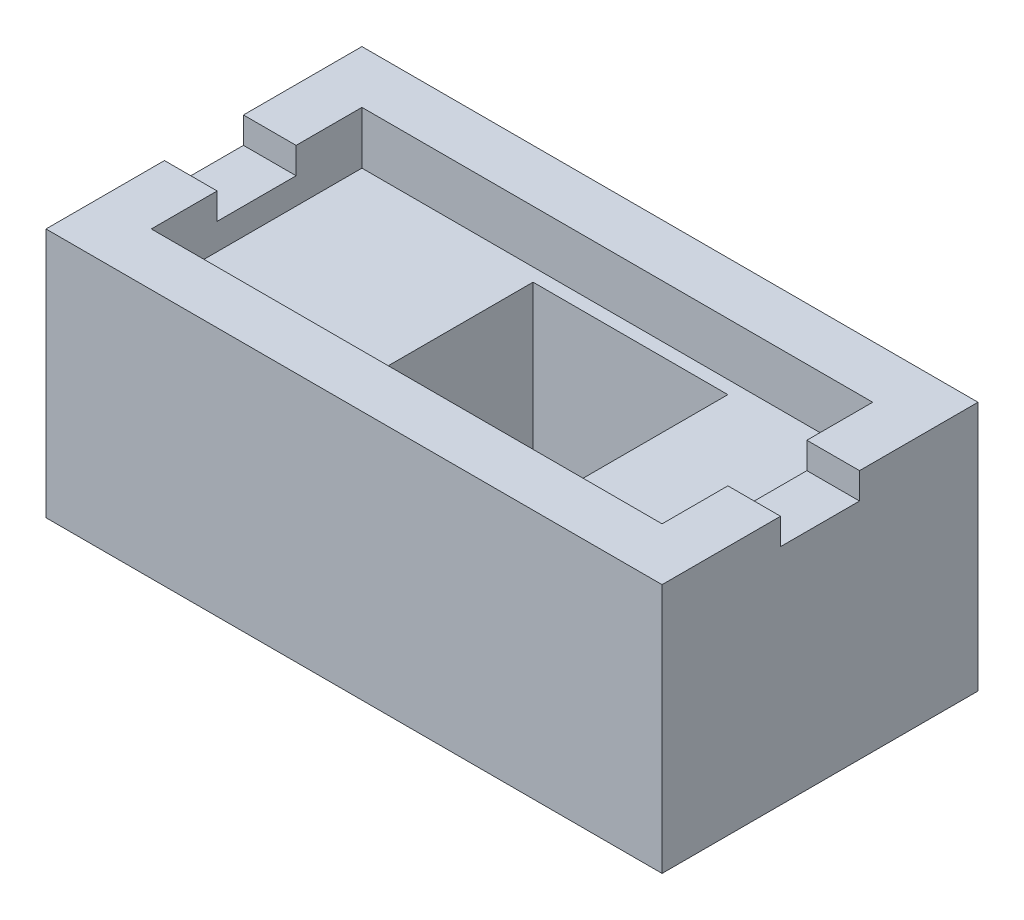
ISO-10303-21;
HEADER;
FILE_DESCRIPTION(('STEP AP214'),'2;1');
FILE_NAME('part.step','',(''),(''),'','','');
FILE_SCHEMA(('AUTOMOTIVE_DESIGN { 1 0 10303 214 1 1 1 1 }'));
ENDSEC;
DATA;
#1=APPLICATION_CONTEXT('core data for automotive mechanical design processes');
#2=APPLICATION_PROTOCOL_DEFINITION('international standard','automotive_design',2000,#1);
#3=PRODUCT_CONTEXT('',#1,'mechanical');
#4=PRODUCT('Part','Part','',(#3));
#5=PRODUCT_RELATED_PRODUCT_CATEGORY('part','',(#4));
#6=PRODUCT_DEFINITION_FORMATION('','',#4);
#7=PRODUCT_DEFINITION_CONTEXT('part definition',#1,'design');
#8=PRODUCT_DEFINITION('design','',#6,#7);
#9=PRODUCT_DEFINITION_SHAPE('','',#8);
#10=(LENGTH_UNIT() NAMED_UNIT(*) SI_UNIT(.MILLI.,.METRE.));
#11=(NAMED_UNIT(*) PLANE_ANGLE_UNIT() SI_UNIT($,.RADIAN.));
#12=(NAMED_UNIT(*) SI_UNIT($,.STERADIAN.) SOLID_ANGLE_UNIT());
#13=UNCERTAINTY_MEASURE_WITH_UNIT(LENGTH_MEASURE(1.E-05),#10,'distance_accuracy_value','');
#14=(GEOMETRIC_REPRESENTATION_CONTEXT(3) GLOBAL_UNCERTAINTY_ASSIGNED_CONTEXT((#13)) GLOBAL_UNIT_ASSIGNED_CONTEXT((#10,
#11,#12)) REPRESENTATION_CONTEXT('',''));
#15=CARTESIAN_POINT('',(0.,0.,0.));
#16=DIRECTION('',(0.,0.,1.));
#17=DIRECTION('',(1.,0.,0.));
#18=AXIS2_PLACEMENT_3D('',#15,#16,#17);
#19=CARTESIAN_POINT('',(9.,9.5,2.5));
#20=DIRECTION('',(0.,0.,-1.));
#21=DIRECTION('',(-1.,0.,0.));
#22=AXIS2_PLACEMENT_3D('',#19,#20,#21);
#23=PLANE('',#22);
#24=DIRECTION('',(1.,0.,0.));
#25=VECTOR('',#24,1.);
#26=CARTESIAN_POINT('',(9.,7.5,2.5));
#27=LINE('',#26,#25);
#28=CARTESIAN_POINT('',(9.,7.5,2.5));
#29=VERTEX_POINT('',#28);
#30=CARTESIAN_POINT('',(16.4,7.5,2.5));
#31=VERTEX_POINT('',#30);
#32=EDGE_CURVE('E73',#29,#31,#27,.T.);
#33=ORIENTED_EDGE('',*,*,#32,.F.);
#34=DIRECTION('',(0.,-1.,0.));
#35=VECTOR('',#34,1.);
#36=CARTESIAN_POINT('',(9.,9.5,2.5));
#37=LINE('',#36,#35);
#38=CARTESIAN_POINT('',(9.,0.,2.5));
#39=VERTEX_POINT('',#38);
#40=EDGE_CURVE('E299',#29,#39,#37,.T.);
#41=ORIENTED_EDGE('',*,*,#40,.T.);
#42=DIRECTION('',(1.,0.,0.));
#43=VECTOR('',#42,1.);
#44=CARTESIAN_POINT('',(9.,0.,2.5));
#45=LINE('',#44,#43);
#46=CARTESIAN_POINT('',(16.4,0.,2.5));
#47=VERTEX_POINT('',#46);
#48=EDGE_CURVE('E286',#39,#47,#45,.T.);
#49=ORIENTED_EDGE('',*,*,#48,.T.);
#50=DIRECTION('',(0.,-1.,0.));
#51=VECTOR('',#50,1.);
#52=CARTESIAN_POINT('',(16.4,9.5,2.5));
#53=LINE('',#52,#51);
#54=EDGE_CURVE('E298',#31,#47,#53,.T.);
#55=ORIENTED_EDGE('',*,*,#54,.F.);
#56=EDGE_LOOP('',(#33,#41,#49,#55));
#57=FACE_BOUND('',#56,.T.);
#58=ADVANCED_FACE('F59',(#57),#23,.F.);
#59=CARTESIAN_POINT('',(9.,9.5,2.5));
#60=DIRECTION('',(1.,0.,0.));
#61=DIRECTION('',(0.,0.,-1.));
#62=AXIS2_PLACEMENT_3D('',#59,#60,#61);
#63=PLANE('',#62);
#64=ORIENTED_EDGE('',*,*,#40,.F.);
#65=DIRECTION('',(0.,0.,1.));
#66=VECTOR('',#65,1.);
#67=CARTESIAN_POINT('',(9.,7.5,2.5));
#68=LINE('',#67,#66);
#69=CARTESIAN_POINT('',(9.,7.5,9.5));
#70=VERTEX_POINT('',#69);
#71=EDGE_CURVE('E249',#29,#70,#68,.T.);
#72=ORIENTED_EDGE('',*,*,#71,.T.);
#73=DIRECTION('',(0.,-1.,0.));
#74=VECTOR('',#73,1.);
#75=CARTESIAN_POINT('',(9.,9.5,9.5));
#76=LINE('',#75,#74);
#77=CARTESIAN_POINT('',(9.,0.,9.5));
#78=VERTEX_POINT('',#77);
#79=EDGE_CURVE('E302',#70,#78,#76,.T.);
#80=ORIENTED_EDGE('',*,*,#79,.T.);
#81=DIRECTION('',(0.,0.,1.));
#82=VECTOR('',#81,1.);
#83=CARTESIAN_POINT('',(9.,0.,2.5));
#84=LINE('',#83,#82);
#85=EDGE_CURVE('E295',#39,#78,#84,.T.);
#86=ORIENTED_EDGE('',*,*,#85,.F.);
#87=EDGE_LOOP('',(#64,#72,#80,#86));
#88=FACE_BOUND('',#87,.T.);
#89=ADVANCED_FACE('F409',(#88),#63,.T.);
#90=CARTESIAN_POINT('',(9.,9.5,9.5));
#91=DIRECTION('',(0.,0.,-1.));
#92=DIRECTION('',(-1.,0.,0.));
#93=AXIS2_PLACEMENT_3D('',#90,#91,#92);
#94=PLANE('',#93);
#95=ORIENTED_EDGE('',*,*,#79,.F.);
#96=DIRECTION('',(1.,0.,0.));
#97=VECTOR('',#96,1.);
#98=CARTESIAN_POINT('',(9.,7.5,9.5));
#99=LINE('',#98,#97);
#100=CARTESIAN_POINT('',(16.4,7.5,9.5));
#101=VERTEX_POINT('',#100);
#102=EDGE_CURVE('E246',#70,#101,#99,.T.);
#103=ORIENTED_EDGE('',*,*,#102,.T.);
#104=DIRECTION('',(0.,-1.,0.));
#105=VECTOR('',#104,1.);
#106=CARTESIAN_POINT('',(16.4,9.5,9.5));
#107=LINE('',#106,#105);
#108=CARTESIAN_POINT('',(16.4,0.,9.5));
#109=VERTEX_POINT('',#108);
#110=EDGE_CURVE('E304',#101,#109,#107,.T.);
#111=ORIENTED_EDGE('',*,*,#110,.T.);
#112=DIRECTION('',(1.,0.,0.));
#113=VECTOR('',#112,1.);
#114=CARTESIAN_POINT('',(9.,0.,9.5));
#115=LINE('',#114,#113);
#116=EDGE_CURVE('E292',#78,#109,#115,.T.);
#117=ORIENTED_EDGE('',*,*,#116,.F.);
#118=EDGE_LOOP('',(#95,#103,#111,#117));
#119=FACE_BOUND('',#118,.T.);
#120=ADVANCED_FACE('F415',(#119),#94,.T.);
#121=CARTESIAN_POINT('',(16.4,9.5,2.5));
#122=DIRECTION('',(1.,0.,0.));
#123=DIRECTION('',(0.,0.,-1.));
#124=AXIS2_PLACEMENT_3D('',#121,#122,#123);
#125=PLANE('',#124);
#126=DIRECTION('',(0.,0.,1.));
#127=VECTOR('',#126,1.);
#128=CARTESIAN_POINT('',(16.4,7.5,2.5));
#129=LINE('',#128,#127);
#130=EDGE_CURVE('E12',#31,#101,#129,.T.);
#131=ORIENTED_EDGE('',*,*,#130,.F.);
#132=ORIENTED_EDGE('',*,*,#54,.T.);
#133=DIRECTION('',(0.,0.,1.));
#134=VECTOR('',#133,1.);
#135=CARTESIAN_POINT('',(16.4,0.,2.5));
#136=LINE('',#135,#134);
#137=EDGE_CURVE('E289',#47,#109,#136,.T.);
#138=ORIENTED_EDGE('',*,*,#137,.T.);
#139=ORIENTED_EDGE('',*,*,#110,.F.);
#140=EDGE_LOOP('',(#131,#132,#138,#139));
#141=FACE_BOUND('',#140,.T.);
#142=ADVANCED_FACE('F406',(#141),#125,.F.);
#143=CARTESIAN_POINT('',(0.,9.5,0.));
#144=DIRECTION('',(0.,-1.,0.));
#145=DIRECTION('',(0.,0.,-1.));
#146=AXIS2_PLACEMENT_3D('',#143,#144,#145);
#147=PLANE('',#146);
#148=DIRECTION('',(1.,0.,0.));
#149=VECTOR('',#148,1.);
#150=CARTESIAN_POINT('',(0.,9.5,4.5));
#151=LINE('',#150,#149);
#152=CARTESIAN_POINT('',(0.,9.5,4.5));
#153=VERTEX_POINT('',#152);
#154=CARTESIAN_POINT('',(2.,9.5,4.5));
#155=VERTEX_POINT('',#154);
#156=EDGE_CURVE('E258',#153,#155,#151,.T.);
#157=ORIENTED_EDGE('',*,*,#156,.T.);
#158=DIRECTION('',(0.,0.,1.));
#159=VECTOR('',#158,1.);
#160=CARTESIAN_POINT('',(2.,9.5,2.));
#161=LINE('',#160,#159);
#162=CARTESIAN_POINT('',(2.,9.5,2.));
#163=VERTEX_POINT('',#162);
#164=EDGE_CURVE('E226',#163,#155,#161,.T.);
#165=ORIENTED_EDGE('',*,*,#164,.F.);
#166=DIRECTION('',(-1.,0.,0.));
#167=VECTOR('',#166,1.);
#168=CARTESIAN_POINT('',(2.,9.5,2.));
#169=LINE('',#168,#167);
#170=CARTESIAN_POINT('',(21.4,9.5,2.));
#171=VERTEX_POINT('',#170);
#172=EDGE_CURVE('E218',#171,#163,#169,.T.);
#173=ORIENTED_EDGE('',*,*,#172,.F.);
#174=DIRECTION('',(0.,0.,-1.));
#175=VECTOR('',#174,1.);
#176=CARTESIAN_POINT('',(21.4,9.5,2.));
#177=LINE('',#176,#175);
#178=CARTESIAN_POINT('',(21.4,9.5,4.5));
#179=VERTEX_POINT('',#178);
#180=EDGE_CURVE('E230',#179,#171,#177,.T.);
#181=ORIENTED_EDGE('',*,*,#180,.F.);
#182=CARTESIAN_POINT('',(23.4,9.5,4.5));
#183=VERTEX_POINT('',#182);
#184=EDGE_CURVE('E273',#179,#183,#151,.T.);
#185=ORIENTED_EDGE('',*,*,#184,.T.);
#186=DIRECTION('',(0.,0.,1.));
#187=VECTOR('',#186,1.);
#188=CARTESIAN_POINT('',(23.4,9.5,0.));
#189=LINE('',#188,#187);
#190=CARTESIAN_POINT('',(23.4,9.5,0.));
#191=VERTEX_POINT('',#190);
#192=EDGE_CURVE('E312',#191,#183,#189,.T.);
#193=ORIENTED_EDGE('',*,*,#192,.F.);
#194=DIRECTION('',(1.,0.,0.));
#195=VECTOR('',#194,1.);
#196=CARTESIAN_POINT('',(0.,9.5,0.));
#197=LINE('',#196,#195);
#198=CARTESIAN_POINT('',(0.,9.5,0.));
#199=VERTEX_POINT('',#198);
#200=EDGE_CURVE('E307',#199,#191,#197,.T.);
#201=ORIENTED_EDGE('',*,*,#200,.F.);
#202=DIRECTION('',(0.,0.,1.));
#203=VECTOR('',#202,1.);
#204=CARTESIAN_POINT('',(0.,9.5,0.));
#205=LINE('',#204,#203);
#206=EDGE_CURVE('E319',#199,#153,#205,.T.);
#207=ORIENTED_EDGE('',*,*,#206,.T.);
#208=EDGE_LOOP('',(#157,#165,#173,#181,#185,#193,#201,#207));
#209=FACE_BOUND('',#208,.T.);
#210=ADVANCED_FACE('F371',(#209),#147,.F.);
#211=CARTESIAN_POINT('',(0.,9.5,0.));
#212=DIRECTION('',(0.,0.,-1.));
#213=DIRECTION('',(-1.,0.,0.));
#214=AXIS2_PLACEMENT_3D('',#211,#212,#213);
#215=PLANE('',#214);
#216=DIRECTION('',(1.,0.,0.));
#217=VECTOR('',#216,1.);
#218=CARTESIAN_POINT('',(0.,0.,0.));
#219=LINE('',#218,#217);
#220=CARTESIAN_POINT('',(0.,0.,0.));
#221=VERTEX_POINT('',#220);
#222=CARTESIAN_POINT('',(23.4,0.,0.));
#223=VERTEX_POINT('',#222);
#224=EDGE_CURVE('E301',#221,#223,#219,.T.);
#225=ORIENTED_EDGE('',*,*,#224,.F.);
#226=DIRECTION('',(0.,-1.,0.));
#227=VECTOR('',#226,1.);
#228=CARTESIAN_POINT('',(0.,9.5,0.));
#229=LINE('',#228,#227);
#230=EDGE_CURVE('E332',#199,#221,#229,.T.);
#231=ORIENTED_EDGE('',*,*,#230,.F.);
#232=ORIENTED_EDGE('',*,*,#200,.T.);
#233=DIRECTION('',(0.,-1.,0.));
#234=VECTOR('',#233,1.);
#235=CARTESIAN_POINT('',(23.4,9.5,0.));
#236=LINE('',#235,#234);
#237=EDGE_CURVE('E322',#191,#223,#236,.T.);
#238=ORIENTED_EDGE('',*,*,#237,.T.);
#239=EDGE_LOOP('',(#225,#231,#232,#238));
#240=FACE_BOUND('',#239,.T.);
#241=ADVANCED_FACE('F61',(#240),#215,.T.);
#242=CARTESIAN_POINT('',(0.,9.5,0.));
#243=DIRECTION('',(1.,0.,0.));
#244=DIRECTION('',(0.,0.,-1.));
#245=AXIS2_PLACEMENT_3D('',#242,#243,#244);
#246=PLANE('',#245);
#247=CARTESIAN_POINT('',(0.,9.5,7.5));
#248=VERTEX_POINT('',#247);
#249=CARTESIAN_POINT('',(0.,9.5,12.));
#250=VERTEX_POINT('',#249);
#251=EDGE_CURVE('E318',#248,#250,#205,.T.);
#252=ORIENTED_EDGE('',*,*,#251,.F.);
#253=DIRECTION('',(0.,1.,0.));
#254=VECTOR('',#253,1.);
#255=CARTESIAN_POINT('',(0.,8.5,7.5));
#256=LINE('',#255,#254);
#257=CARTESIAN_POINT('',(0.,8.5,7.5));
#258=VERTEX_POINT('',#257);
#259=EDGE_CURVE('E281',#258,#248,#256,.T.);
#260=ORIENTED_EDGE('',*,*,#259,.F.);
#261=DIRECTION('',(0.,0.,1.));
#262=VECTOR('',#261,1.);
#263=CARTESIAN_POINT('',(0.,8.5,0.));
#264=LINE('',#263,#262);
#265=CARTESIAN_POINT('',(0.,8.5,4.5));
#266=VERTEX_POINT('',#265);
#267=EDGE_CURVE('E262',#266,#258,#264,.T.);
#268=ORIENTED_EDGE('',*,*,#267,.F.);
#269=DIRECTION('',(0.,1.,0.));
#270=VECTOR('',#269,1.);
#271=CARTESIAN_POINT('',(0.,8.5,4.5));
#272=LINE('',#271,#270);
#273=EDGE_CURVE('E278',#266,#153,#272,.T.);
#274=ORIENTED_EDGE('',*,*,#273,.T.);
#275=ORIENTED_EDGE('',*,*,#206,.F.);
#276=ORIENTED_EDGE('',*,*,#230,.T.);
#277=DIRECTION('',(0.,0.,1.));
#278=VECTOR('',#277,1.);
#279=CARTESIAN_POINT('',(0.,0.,0.));
#280=LINE('',#279,#278);
#281=CARTESIAN_POINT('',(0.,0.,12.));
#282=VERTEX_POINT('',#281);
#283=EDGE_CURVE('E311',#221,#282,#280,.T.);
#284=ORIENTED_EDGE('',*,*,#283,.T.);
#285=DIRECTION('',(0.,-1.,0.));
#286=VECTOR('',#285,1.);
#287=CARTESIAN_POINT('',(0.,9.5,12.));
#288=LINE('',#287,#286);
#289=EDGE_CURVE('E335',#250,#282,#288,.T.);
#290=ORIENTED_EDGE('',*,*,#289,.F.);
#291=EDGE_LOOP('',(#252,#260,#268,#274,#275,#276,#284,#290));
#292=FACE_BOUND('',#291,.T.);
#293=ADVANCED_FACE('F383',(#292),#246,.F.);
#294=CARTESIAN_POINT('',(0.,9.5,12.));
#295=DIRECTION('',(0.,0.,-1.));
#296=DIRECTION('',(-1.,0.,0.));
#297=AXIS2_PLACEMENT_3D('',#294,#295,#296);
#298=PLANE('',#297);
#299=DIRECTION('',(1.,0.,0.));
#300=VECTOR('',#299,1.);
#301=CARTESIAN_POINT('',(0.,0.,12.));
#302=LINE('',#301,#300);
#303=CARTESIAN_POINT('',(23.4,0.,12.));
#304=VERTEX_POINT('',#303);
#305=EDGE_CURVE('E328',#282,#304,#302,.T.);
#306=ORIENTED_EDGE('',*,*,#305,.T.);
#307=DIRECTION('',(0.,-1.,0.));
#308=VECTOR('',#307,1.);
#309=CARTESIAN_POINT('',(23.4,9.5,12.));
#310=LINE('',#309,#308);
#311=CARTESIAN_POINT('',(23.4,9.5,12.));
#312=VERTEX_POINT('',#311);
#313=EDGE_CURVE('E338',#312,#304,#310,.T.);
#314=ORIENTED_EDGE('',*,*,#313,.F.);
#315=DIRECTION('',(1.,0.,0.));
#316=VECTOR('',#315,1.);
#317=CARTESIAN_POINT('',(0.,9.5,12.));
#318=LINE('',#317,#316);
#319=EDGE_CURVE('E315',#250,#312,#318,.T.);
#320=ORIENTED_EDGE('',*,*,#319,.F.);
#321=ORIENTED_EDGE('',*,*,#289,.T.);
#322=EDGE_LOOP('',(#306,#314,#320,#321));
#323=FACE_BOUND('',#322,.T.);
#324=ADVANCED_FACE('F395',(#323),#298,.F.);
#325=CARTESIAN_POINT('',(23.4,9.5,0.));
#326=DIRECTION('',(1.,0.,0.));
#327=DIRECTION('',(0.,0.,-1.));
#328=AXIS2_PLACEMENT_3D('',#325,#326,#327);
#329=PLANE('',#328);
#330=DIRECTION('',(0.,1.,0.));
#331=VECTOR('',#330,1.);
#332=CARTESIAN_POINT('',(23.4,8.5,7.5));
#333=LINE('',#332,#331);
#334=CARTESIAN_POINT('',(23.4,8.5,7.5));
#335=VERTEX_POINT('',#334);
#336=CARTESIAN_POINT('',(23.4,9.5,7.5));
#337=VERTEX_POINT('',#336);
#338=EDGE_CURVE('E283',#335,#337,#333,.T.);
#339=ORIENTED_EDGE('',*,*,#338,.T.);
#340=EDGE_CURVE('E310',#337,#312,#189,.T.);
#341=ORIENTED_EDGE('',*,*,#340,.T.);
#342=ORIENTED_EDGE('',*,*,#313,.T.);
#343=DIRECTION('',(0.,0.,1.));
#344=VECTOR('',#343,1.);
#345=CARTESIAN_POINT('',(23.4,0.,0.));
#346=LINE('',#345,#344);
#347=EDGE_CURVE('E325',#223,#304,#346,.T.);
#348=ORIENTED_EDGE('',*,*,#347,.F.);
#349=ORIENTED_EDGE('',*,*,#237,.F.);
#350=ORIENTED_EDGE('',*,*,#192,.T.);
#351=DIRECTION('',(0.,1.,0.));
#352=VECTOR('',#351,1.);
#353=CARTESIAN_POINT('',(23.4,8.5,4.5));
#354=LINE('',#353,#352);
#355=CARTESIAN_POINT('',(23.4,8.5,4.5));
#356=VERTEX_POINT('',#355);
#357=EDGE_CURVE('E269',#356,#183,#354,.T.);
#358=ORIENTED_EDGE('',*,*,#357,.F.);
#359=DIRECTION('',(0.,0.,1.));
#360=VECTOR('',#359,1.);
#361=CARTESIAN_POINT('',(23.4,8.5,0.));
#362=LINE('',#361,#360);
#363=EDGE_CURVE('E254',#356,#335,#362,.T.);
#364=ORIENTED_EDGE('',*,*,#363,.T.);
#365=EDGE_LOOP('',(#339,#341,#342,#348,#349,#350,#358,#364));
#366=FACE_BOUND('',#365,.T.);
#367=ADVANCED_FACE('F356',(#366),#329,.T.);
#368=DIRECTION('',(1.,0.,0.));
#369=VECTOR('',#368,1.);
#370=CARTESIAN_POINT('',(2.,9.5,10.));
#371=LINE('',#370,#369);
#372=CARTESIAN_POINT('',(2.,9.5,10.));
#373=VERTEX_POINT('',#372);
#374=CARTESIAN_POINT('',(21.4,9.5,10.));
#375=VERTEX_POINT('',#374);
#376=EDGE_CURVE('E228',#373,#375,#371,.T.);
#377=ORIENTED_EDGE('',*,*,#376,.F.);
#378=CARTESIAN_POINT('',(2.,9.5,7.5));
#379=VERTEX_POINT('',#378);
#380=EDGE_CURVE('E201',#379,#373,#161,.T.);
#381=ORIENTED_EDGE('',*,*,#380,.F.);
#382=DIRECTION('',(1.,0.,0.));
#383=VECTOR('',#382,1.);
#384=CARTESIAN_POINT('',(0.,9.5,7.5));
#385=LINE('',#384,#383);
#386=EDGE_CURVE('E270',#248,#379,#385,.T.);
#387=ORIENTED_EDGE('',*,*,#386,.F.);
#388=ORIENTED_EDGE('',*,*,#251,.T.);
#389=ORIENTED_EDGE('',*,*,#319,.T.);
#390=ORIENTED_EDGE('',*,*,#340,.F.);
#391=CARTESIAN_POINT('',(21.4,9.5,7.5));
#392=VERTEX_POINT('',#391);
#393=EDGE_CURVE('E253',#392,#337,#385,.T.);
#394=ORIENTED_EDGE('',*,*,#393,.F.);
#395=EDGE_CURVE('E221',#375,#392,#177,.T.);
#396=ORIENTED_EDGE('',*,*,#395,.F.);
#397=EDGE_LOOP('',(#377,#381,#387,#388,#389,#390,#394,#396));
#398=FACE_BOUND('',#397,.T.);
#399=ADVANCED_FACE('F352',(#398),#147,.F.);
#400=CARTESIAN_POINT('',(0.,0.,0.));
#401=DIRECTION('',(0.,-1.,0.));
#402=DIRECTION('',(0.,0.,-1.));
#403=AXIS2_PLACEMENT_3D('',#400,#401,#402);
#404=PLANE('',#403);
#405=ORIENTED_EDGE('',*,*,#48,.F.);
#406=ORIENTED_EDGE('',*,*,#85,.T.);
#407=ORIENTED_EDGE('',*,*,#116,.T.);
#408=ORIENTED_EDGE('',*,*,#137,.F.);
#409=EDGE_LOOP('',(#405,#406,#407,#408));
#410=FACE_BOUND('',#409,.T.);
#411=ORIENTED_EDGE('',*,*,#224,.T.);
#412=ORIENTED_EDGE('',*,*,#347,.T.);
#413=ORIENTED_EDGE('',*,*,#305,.F.);
#414=ORIENTED_EDGE('',*,*,#283,.F.);
#415=EDGE_LOOP('',(#411,#412,#413,#414));
#416=FACE_BOUND('',#415,.T.);
#417=ADVANCED_FACE('F397',(#410,#416),#404,.T.);
#418=CARTESIAN_POINT('',(0.,8.5,0.));
#419=DIRECTION('',(0.,1.,0.));
#420=DIRECTION('',(0.,0.,1.));
#421=AXIS2_PLACEMENT_3D('',#418,#419,#420);
#422=PLANE('',#421);
#423=DIRECTION('',(0.,0.,-1.));
#424=VECTOR('',#423,1.);
#425=CARTESIAN_POINT('',(21.4,8.5,0.));
#426=LINE('',#425,#424);
#427=CARTESIAN_POINT('',(21.4,8.5,7.5));
#428=VERTEX_POINT('',#427);
#429=CARTESIAN_POINT('',(21.4,8.5,4.5));
#430=VERTEX_POINT('',#429);
#431=EDGE_CURVE('E242',#428,#430,#426,.T.);
#432=ORIENTED_EDGE('',*,*,#431,.F.);
#433=DIRECTION('',(1.,0.,0.));
#434=VECTOR('',#433,1.);
#435=CARTESIAN_POINT('',(0.,8.5,7.5));
#436=LINE('',#435,#434);
#437=EDGE_CURVE('E257',#428,#335,#436,.T.);
#438=ORIENTED_EDGE('',*,*,#437,.T.);
#439=ORIENTED_EDGE('',*,*,#363,.F.);
#440=DIRECTION('',(1.,0.,0.));
#441=VECTOR('',#440,1.);
#442=CARTESIAN_POINT('',(0.,8.5,4.5));
#443=LINE('',#442,#441);
#444=EDGE_CURVE('E265',#430,#356,#443,.T.);
#445=ORIENTED_EDGE('',*,*,#444,.F.);
#446=EDGE_LOOP('',(#432,#438,#439,#445));
#447=FACE_BOUND('',#446,.T.);
#448=ADVANCED_FACE('F362',(#447),#422,.T.);
#449=CARTESIAN_POINT('',(0.,8.5,4.5));
#450=DIRECTION('',(0.,0.,1.));
#451=DIRECTION('',(1.,0.,0.));
#452=AXIS2_PLACEMENT_3D('',#449,#450,#451);
#453=PLANE('',#452);
#454=DIRECTION('',(0.,1.,0.));
#455=VECTOR('',#454,1.);
#456=CARTESIAN_POINT('',(21.4,8.5,4.5));
#457=LINE('',#456,#455);
#458=EDGE_CURVE('E244',#430,#179,#457,.T.);
#459=ORIENTED_EDGE('',*,*,#458,.F.);
#460=ORIENTED_EDGE('',*,*,#444,.T.);
#461=ORIENTED_EDGE('',*,*,#357,.T.);
#462=ORIENTED_EDGE('',*,*,#184,.F.);
#463=EDGE_LOOP('',(#459,#460,#461,#462));
#464=FACE_BOUND('',#463,.T.);
#465=ADVANCED_FACE('F368',(#464),#453,.T.);
#466=CARTESIAN_POINT('',(0.,8.5,7.5));
#467=DIRECTION('',(0.,0.,1.));
#468=DIRECTION('',(1.,0.,0.));
#469=AXIS2_PLACEMENT_3D('',#466,#467,#468);
#470=PLANE('',#469);
#471=ORIENTED_EDGE('',*,*,#437,.F.);
#472=DIRECTION('',(0.,1.,0.));
#473=VECTOR('',#472,1.);
#474=CARTESIAN_POINT('',(21.4,8.5,7.5));
#475=LINE('',#474,#473);
#476=EDGE_CURVE('E67',#428,#392,#475,.T.);
#477=ORIENTED_EDGE('',*,*,#476,.T.);
#478=ORIENTED_EDGE('',*,*,#393,.T.);
#479=ORIENTED_EDGE('',*,*,#338,.F.);
#480=EDGE_LOOP('',(#471,#477,#478,#479));
#481=FACE_BOUND('',#480,.T.);
#482=ADVANCED_FACE('F345',(#481),#470,.F.);
#483=ORIENTED_EDGE('',*,*,#386,.T.);
#484=DIRECTION('',(0.,-1.,0.));
#485=VECTOR('',#484,1.);
#486=CARTESIAN_POINT('',(2.,8.5,7.5));
#487=LINE('',#486,#485);
#488=CARTESIAN_POINT('',(2.,8.5,7.5));
#489=VERTEX_POINT('',#488);
#490=EDGE_CURVE('E239',#379,#489,#487,.T.);
#491=ORIENTED_EDGE('',*,*,#490,.T.);
#492=EDGE_CURVE('E259',#258,#489,#436,.T.);
#493=ORIENTED_EDGE('',*,*,#492,.F.);
#494=ORIENTED_EDGE('',*,*,#259,.T.);
#495=EDGE_LOOP('',(#483,#491,#493,#494));
#496=FACE_BOUND('',#495,.T.);
#497=ADVANCED_FACE('F390',(#496),#470,.F.);
#498=DIRECTION('',(0.,-1.,0.));
#499=VECTOR('',#498,1.);
#500=CARTESIAN_POINT('',(2.,8.5,4.5));
#501=LINE('',#500,#499);
#502=CARTESIAN_POINT('',(2.,8.5,4.5));
#503=VERTEX_POINT('',#502);
#504=EDGE_CURVE('E81',#155,#503,#501,.T.);
#505=ORIENTED_EDGE('',*,*,#504,.F.);
#506=ORIENTED_EDGE('',*,*,#156,.F.);
#507=ORIENTED_EDGE('',*,*,#273,.F.);
#508=EDGE_CURVE('E266',#266,#503,#443,.T.);
#509=ORIENTED_EDGE('',*,*,#508,.T.);
#510=EDGE_LOOP('',(#505,#506,#507,#509));
#511=FACE_BOUND('',#510,.T.);
#512=ADVANCED_FACE('F378',(#511),#453,.T.);
#513=DIRECTION('',(0.,0.,1.));
#514=VECTOR('',#513,1.);
#515=CARTESIAN_POINT('',(2.,8.5,0.));
#516=LINE('',#515,#514);
#517=EDGE_CURVE('E334',#503,#489,#516,.T.);
#518=ORIENTED_EDGE('',*,*,#517,.F.);
#519=ORIENTED_EDGE('',*,*,#508,.F.);
#520=ORIENTED_EDGE('',*,*,#267,.T.);
#521=ORIENTED_EDGE('',*,*,#492,.T.);
#522=EDGE_LOOP('',(#518,#519,#520,#521));
#523=FACE_BOUND('',#522,.T.);
#524=ADVANCED_FACE('F388',(#523),#422,.T.);
#525=CARTESIAN_POINT('',(0.,7.5,0.));
#526=DIRECTION('',(0.,1.,0.));
#527=DIRECTION('',(0.,0.,1.));
#528=AXIS2_PLACEMENT_3D('',#525,#526,#527);
#529=PLANE('',#528);
#530=DIRECTION('',(0.,0.,1.));
#531=VECTOR('',#530,1.);
#532=CARTESIAN_POINT('',(2.,7.5,2.));
#533=LINE('',#532,#531);
#534=CARTESIAN_POINT('',(2.,7.5,2.));
#535=VERTEX_POINT('',#534);
#536=CARTESIAN_POINT('',(2.,7.5,10.));
#537=VERTEX_POINT('',#536);
#538=EDGE_CURVE('E198',#535,#537,#533,.T.);
#539=ORIENTED_EDGE('',*,*,#538,.T.);
#540=DIRECTION('',(1.,0.,0.));
#541=VECTOR('',#540,1.);
#542=CARTESIAN_POINT('',(2.,7.5,10.));
#543=LINE('',#542,#541);
#544=CARTESIAN_POINT('',(21.4,7.5,10.));
#545=VERTEX_POINT('',#544);
#546=EDGE_CURVE('E209',#537,#545,#543,.T.);
#547=ORIENTED_EDGE('',*,*,#546,.T.);
#548=DIRECTION('',(0.,0.,-1.));
#549=VECTOR('',#548,1.);
#550=CARTESIAN_POINT('',(21.4,7.5,2.));
#551=LINE('',#550,#549);
#552=CARTESIAN_POINT('',(21.4,7.5,2.));
#553=VERTEX_POINT('',#552);
#554=EDGE_CURVE('E214',#545,#553,#551,.T.);
#555=ORIENTED_EDGE('',*,*,#554,.T.);
#556=DIRECTION('',(-1.,0.,0.));
#557=VECTOR('',#556,1.);
#558=CARTESIAN_POINT('',(2.,7.5,2.));
#559=LINE('',#558,#557);
#560=EDGE_CURVE('E206',#553,#535,#559,.T.);
#561=ORIENTED_EDGE('',*,*,#560,.T.);
#562=EDGE_LOOP('',(#539,#547,#555,#561));
#563=FACE_BOUND('',#562,.T.);
#564=ORIENTED_EDGE('',*,*,#32,.T.);
#565=ORIENTED_EDGE('',*,*,#130,.T.);
#566=ORIENTED_EDGE('',*,*,#102,.F.);
#567=ORIENTED_EDGE('',*,*,#71,.F.);
#568=EDGE_LOOP('',(#564,#565,#566,#567));
#569=FACE_BOUND('',#568,.T.);
#570=ADVANCED_FACE('F216',(#563,#569),#529,.T.);
#571=CARTESIAN_POINT('',(2.,7.5,2.));
#572=DIRECTION('',(-1.,0.,0.));
#573=DIRECTION('',(0.,0.,1.));
#574=AXIS2_PLACEMENT_3D('',#571,#572,#573);
#575=PLANE('',#574);
#576=ORIENTED_EDGE('',*,*,#380,.T.);
#577=DIRECTION('',(0.,1.,0.));
#578=VECTOR('',#577,1.);
#579=CARTESIAN_POINT('',(2.,7.5,10.));
#580=LINE('',#579,#578);
#581=EDGE_CURVE('E194',#537,#373,#580,.T.);
#582=ORIENTED_EDGE('',*,*,#581,.F.);
#583=ORIENTED_EDGE('',*,*,#538,.F.);
#584=DIRECTION('',(0.,1.,0.));
#585=VECTOR('',#584,1.);
#586=CARTESIAN_POINT('',(2.,7.5,2.));
#587=LINE('',#586,#585);
#588=EDGE_CURVE('E232',#535,#163,#587,.T.);
#589=ORIENTED_EDGE('',*,*,#588,.T.);
#590=ORIENTED_EDGE('',*,*,#164,.T.);
#591=ORIENTED_EDGE('',*,*,#504,.T.);
#592=ORIENTED_EDGE('',*,*,#517,.T.);
#593=ORIENTED_EDGE('',*,*,#490,.F.);
#594=EDGE_LOOP('',(#576,#582,#583,#589,#590,#591,#592,#593));
#595=FACE_BOUND('',#594,.T.);
#596=ADVANCED_FACE('F196',(#595),#575,.F.);
#597=CARTESIAN_POINT('',(2.,7.5,2.));
#598=DIRECTION('',(0.,0.,-1.));
#599=DIRECTION('',(-1.,0.,0.));
#600=AXIS2_PLACEMENT_3D('',#597,#598,#599);
#601=PLANE('',#600);
#602=ORIENTED_EDGE('',*,*,#172,.T.);
#603=ORIENTED_EDGE('',*,*,#588,.F.);
#604=ORIENTED_EDGE('',*,*,#560,.F.);
#605=DIRECTION('',(0.,1.,0.));
#606=VECTOR('',#605,1.);
#607=CARTESIAN_POINT('',(21.4,7.5,2.));
#608=LINE('',#607,#606);
#609=EDGE_CURVE('E234',#553,#171,#608,.T.);
#610=ORIENTED_EDGE('',*,*,#609,.T.);
#611=EDGE_LOOP('',(#602,#603,#604,#610));
#612=FACE_BOUND('',#611,.T.);
#613=ADVANCED_FACE('F376',(#612),#601,.F.);
#614=CARTESIAN_POINT('',(21.4,7.5,2.));
#615=DIRECTION('',(1.,0.,0.));
#616=DIRECTION('',(0.,0.,-1.));
#617=AXIS2_PLACEMENT_3D('',#614,#615,#616);
#618=PLANE('',#617);
#619=ORIENTED_EDGE('',*,*,#458,.T.);
#620=ORIENTED_EDGE('',*,*,#180,.T.);
#621=ORIENTED_EDGE('',*,*,#609,.F.);
#622=ORIENTED_EDGE('',*,*,#554,.F.);
#623=DIRECTION('',(0.,1.,0.));
#624=VECTOR('',#623,1.);
#625=CARTESIAN_POINT('',(21.4,7.5,10.));
#626=LINE('',#625,#624);
#627=EDGE_CURVE('E205',#545,#375,#626,.T.);
#628=ORIENTED_EDGE('',*,*,#627,.T.);
#629=ORIENTED_EDGE('',*,*,#395,.T.);
#630=ORIENTED_EDGE('',*,*,#476,.F.);
#631=ORIENTED_EDGE('',*,*,#431,.T.);
#632=EDGE_LOOP('',(#619,#620,#621,#622,#628,#629,#630,#631));
#633=FACE_BOUND('',#632,.T.);
#634=ADVANCED_FACE('F364',(#633),#618,.F.);
#635=CARTESIAN_POINT('',(2.,7.5,10.));
#636=DIRECTION('',(0.,0.,1.));
#637=DIRECTION('',(1.,0.,0.));
#638=AXIS2_PLACEMENT_3D('',#635,#636,#637);
#639=PLANE('',#638);
#640=ORIENTED_EDGE('',*,*,#376,.T.);
#641=ORIENTED_EDGE('',*,*,#627,.F.);
#642=ORIENTED_EDGE('',*,*,#546,.F.);
#643=ORIENTED_EDGE('',*,*,#581,.T.);
#644=EDGE_LOOP('',(#640,#641,#642,#643));
#645=FACE_BOUND('',#644,.T.);
#646=ADVANCED_FACE('F210',(#645),#639,.F.);
#647=CLOSED_SHELL('',(#58,#89,#120,#142,#210,#241,#293,#324,#367,#399,#417,#448,#465,#482,#497,
#512,#524,#570,#596,#613,#634,#646));
#648=MANIFOLD_SOLID_BREP('B2',#647);
#649=ADVANCED_BREP_SHAPE_REPRESENTATION('',(#18,#648),#14);
#650=SHAPE_DEFINITION_REPRESENTATION(#9,#649);
ENDSEC;
END-ISO-10303-21;
